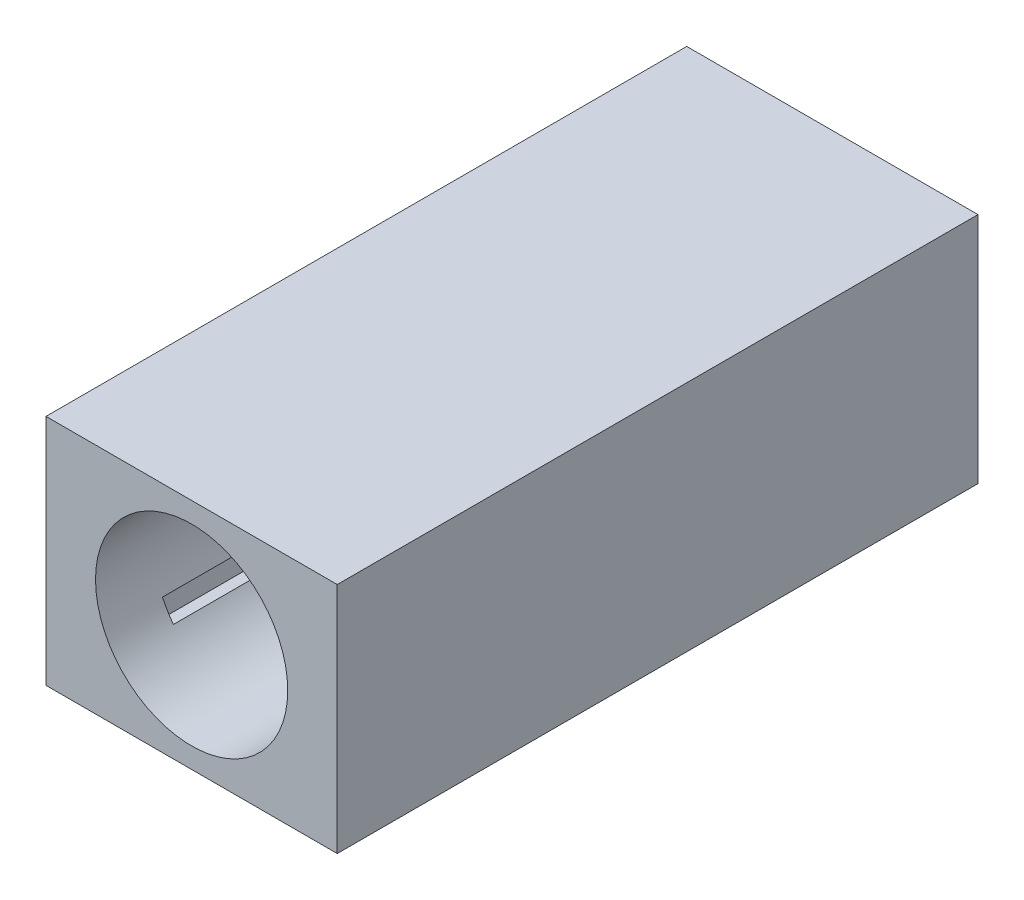
ISO-10303-21;
HEADER;
FILE_DESCRIPTION(('STEP AP214'),'2;1');
FILE_NAME('part.step','',(''),(''),'','','');
FILE_SCHEMA(('AUTOMOTIVE_DESIGN { 1 0 10303 214 1 1 1 1 }'));
ENDSEC;
DATA;
#1=APPLICATION_CONTEXT('core data for automotive mechanical design processes');
#2=APPLICATION_PROTOCOL_DEFINITION('international standard','automotive_design',2000,#1);
#3=PRODUCT_CONTEXT('',#1,'mechanical');
#4=PRODUCT('Part','Part','',(#3));
#5=PRODUCT_RELATED_PRODUCT_CATEGORY('part','',(#4));
#6=PRODUCT_DEFINITION_FORMATION('','',#4);
#7=PRODUCT_DEFINITION_CONTEXT('part definition',#1,'design');
#8=PRODUCT_DEFINITION('design','',#6,#7);
#9=PRODUCT_DEFINITION_SHAPE('','',#8);
#10=(LENGTH_UNIT() NAMED_UNIT(*) SI_UNIT(.MILLI.,.METRE.));
#11=(NAMED_UNIT(*) PLANE_ANGLE_UNIT() SI_UNIT($,.RADIAN.));
#12=(NAMED_UNIT(*) SI_UNIT($,.STERADIAN.) SOLID_ANGLE_UNIT());
#13=UNCERTAINTY_MEASURE_WITH_UNIT(LENGTH_MEASURE(1.E-05),#10,'distance_accuracy_value','');
#14=(GEOMETRIC_REPRESENTATION_CONTEXT(3) GLOBAL_UNCERTAINTY_ASSIGNED_CONTEXT((#13)) GLOBAL_UNIT_ASSIGNED_CONTEXT((#10,
#11,#12)) REPRESENTATION_CONTEXT('',''));
#15=CARTESIAN_POINT('',(0.,0.,0.));
#16=DIRECTION('',(0.,0.,1.));
#17=DIRECTION('',(1.,0.,0.));
#18=AXIS2_PLACEMENT_3D('',#15,#16,#17);
#19=CARTESIAN_POINT('',(1.5,-1.,10.));
#20=DIRECTION('',(-1.,0.,0.));
#21=DIRECTION('',(0.,0.,1.));
#22=AXIS2_PLACEMENT_3D('',#19,#20,#21);
#23=PLANE('',#22);
#24=DIRECTION('',(0.,0.,1.));
#25=VECTOR('',#24,1.);
#26=CARTESIAN_POINT('',(1.5,-0.687386354243377,0.));
#27=LINE('',#26,#25);
#28=CARTESIAN_POINT('',(1.5,-0.687386354243377,0.));
#29=VERTEX_POINT('',#28);
#30=CARTESIAN_POINT('',(1.5,-0.687386354243377,10.));
#31=VERTEX_POINT('',#30);
#32=EDGE_CURVE('E288',#29,#31,#27,.T.);
#33=ORIENTED_EDGE('',*,*,#32,.F.);
#34=DIRECTION('',(0.,1.,0.));
#35=VECTOR('',#34,1.);
#36=CARTESIAN_POINT('',(1.5,-1.,0.));
#37=LINE('',#36,#35);
#38=CARTESIAN_POINT('',(1.5,-1.,0.));
#39=VERTEX_POINT('',#38);
#40=EDGE_CURVE('E161',#39,#29,#37,.T.);
#41=ORIENTED_EDGE('',*,*,#40,.F.);
#42=DIRECTION('',(0.,0.,-1.));
#43=VECTOR('',#42,1.);
#44=CARTESIAN_POINT('',(1.5,-1.,10.));
#45=LINE('',#44,#43);
#46=CARTESIAN_POINT('',(1.5,-1.,10.));
#47=VERTEX_POINT('',#46);
#48=EDGE_CURVE('E189',#47,#39,#45,.T.);
#49=ORIENTED_EDGE('',*,*,#48,.F.);
#50=DIRECTION('',(0.,1.,0.));
#51=VECTOR('',#50,1.);
#52=CARTESIAN_POINT('',(1.5,-1.,10.));
#53=LINE('',#52,#51);
#54=EDGE_CURVE('E245',#47,#31,#53,.T.);
#55=ORIENTED_EDGE('',*,*,#54,.T.);
#56=EDGE_LOOP('',(#33,#41,#49,#55));
#57=FACE_BOUND('',#56,.T.);
#58=ADVANCED_FACE('F33',(#57),#23,.T.);
#59=CARTESIAN_POINT('',(1.5,0.999999999999999,10.));
#60=DIRECTION('',(0.,-1.,0.));
#61=DIRECTION('',(1.,0.,0.));
#62=AXIS2_PLACEMENT_3D('',#59,#60,#61);
#63=PLANE('',#62);
#64=DIRECTION('',(0.,0.,1.));
#65=VECTOR('',#64,1.);
#66=CARTESIAN_POINT('',(1.31244047484067,0.999999999999999,0.));
#67=LINE('',#66,#65);
#68=CARTESIAN_POINT('',(1.31244047484067,0.999999999999999,0.));
#69=VERTEX_POINT('',#68);
#70=CARTESIAN_POINT('',(1.31244047484067,0.999999999999999,10.));
#71=VERTEX_POINT('',#70);
#72=EDGE_CURVE('E155',#69,#71,#67,.T.);
#73=ORIENTED_EDGE('',*,*,#72,.F.);
#74=DIRECTION('',(-1.,0.,0.));
#75=VECTOR('',#74,1.);
#76=CARTESIAN_POINT('',(1.5,0.999999999999999,0.));
#77=LINE('',#76,#75);
#78=CARTESIAN_POINT('',(1.5,0.999999999999999,0.));
#79=VERTEX_POINT('',#78);
#80=EDGE_CURVE('E179',#79,#69,#77,.T.);
#81=ORIENTED_EDGE('',*,*,#80,.F.);
#82=DIRECTION('',(0.,0.,-1.));
#83=VECTOR('',#82,1.);
#84=CARTESIAN_POINT('',(1.5,0.999999999999999,10.));
#85=LINE('',#84,#83);
#86=CARTESIAN_POINT('',(1.5,0.999999999999999,10.));
#87=VERTEX_POINT('',#86);
#88=EDGE_CURVE('E168',#87,#79,#85,.T.);
#89=ORIENTED_EDGE('',*,*,#88,.F.);
#90=DIRECTION('',(-1.,0.,0.));
#91=VECTOR('',#90,1.);
#92=CARTESIAN_POINT('',(1.5,0.999999999999999,10.));
#93=LINE('',#92,#91);
#94=EDGE_CURVE('E249',#87,#71,#93,.T.);
#95=ORIENTED_EDGE('',*,*,#94,.T.);
#96=EDGE_LOOP('',(#73,#81,#89,#95));
#97=FACE_BOUND('',#96,.T.);
#98=ADVANCED_FACE('F295',(#97),#63,.T.);
#99=CARTESIAN_POINT('',(-1.5,0.999999999999999,10.));
#100=DIRECTION('',(1.,0.,0.));
#101=DIRECTION('',(0.,1.,0.));
#102=AXIS2_PLACEMENT_3D('',#99,#100,#101);
#103=PLANE('',#102);
#104=DIRECTION('',(0.,0.,1.));
#105=VECTOR('',#104,1.);
#106=CARTESIAN_POINT('',(-1.5,0.687386354243376,0.));
#107=LINE('',#106,#105);
#108=CARTESIAN_POINT('',(-1.5,0.687386354243376,0.));
#109=VERTEX_POINT('',#108);
#110=CARTESIAN_POINT('',(-1.5,0.687386354243376,10.));
#111=VERTEX_POINT('',#110);
#112=EDGE_CURVE('E282',#109,#111,#107,.T.);
#113=ORIENTED_EDGE('',*,*,#112,.F.);
#114=DIRECTION('',(0.,-1.,0.));
#115=VECTOR('',#114,1.);
#116=CARTESIAN_POINT('',(-1.5,0.999999999999999,0.));
#117=LINE('',#116,#115);
#118=CARTESIAN_POINT('',(-1.5,0.999999999999999,0.));
#119=VERTEX_POINT('',#118);
#120=EDGE_CURVE('E182',#119,#109,#117,.T.);
#121=ORIENTED_EDGE('',*,*,#120,.F.);
#122=DIRECTION('',(0.,0.,-1.));
#123=VECTOR('',#122,1.);
#124=CARTESIAN_POINT('',(-1.5,0.999999999999999,10.));
#125=LINE('',#124,#123);
#126=CARTESIAN_POINT('',(-1.5,0.999999999999999,10.));
#127=VERTEX_POINT('',#126);
#128=EDGE_CURVE('E195',#127,#119,#125,.T.);
#129=ORIENTED_EDGE('',*,*,#128,.F.);
#130=DIRECTION('',(0.,-1.,0.));
#131=VECTOR('',#130,1.);
#132=CARTESIAN_POINT('',(-1.5,0.999999999999999,10.));
#133=LINE('',#132,#131);
#134=EDGE_CURVE('E252',#127,#111,#133,.T.);
#135=ORIENTED_EDGE('',*,*,#134,.T.);
#136=EDGE_LOOP('',(#113,#121,#129,#135));
#137=FACE_BOUND('',#136,.T.);
#138=ADVANCED_FACE('F301',(#137),#103,.T.);
#139=CARTESIAN_POINT('',(-1.5,-1.,10.));
#140=DIRECTION('',(0.,1.,0.));
#141=DIRECTION('',(0.,0.,1.));
#142=AXIS2_PLACEMENT_3D('',#139,#140,#141);
#143=PLANE('',#142);
#144=DIRECTION('',(0.,0.,1.));
#145=VECTOR('',#144,1.);
#146=CARTESIAN_POINT('',(-1.31244047484067,-1.,0.));
#147=LINE('',#146,#145);
#148=CARTESIAN_POINT('',(-1.31244047484067,-1.,0.));
#149=VERTEX_POINT('',#148);
#150=CARTESIAN_POINT('',(-1.31244047484067,-1.,10.));
#151=VERTEX_POINT('',#150);
#152=EDGE_CURVE('E274',#149,#151,#147,.T.);
#153=ORIENTED_EDGE('',*,*,#152,.F.);
#154=DIRECTION('',(1.,0.,0.));
#155=VECTOR('',#154,1.);
#156=CARTESIAN_POINT('',(-1.5,-1.,0.));
#157=LINE('',#156,#155);
#158=CARTESIAN_POINT('',(-1.5,-1.,0.));
#159=VERTEX_POINT('',#158);
#160=EDGE_CURVE('E185',#159,#149,#157,.T.);
#161=ORIENTED_EDGE('',*,*,#160,.F.);
#162=DIRECTION('',(0.,0.,-1.));
#163=VECTOR('',#162,1.);
#164=CARTESIAN_POINT('',(-1.5,-1.,10.));
#165=LINE('',#164,#163);
#166=CARTESIAN_POINT('',(-1.5,-1.,10.));
#167=VERTEX_POINT('',#166);
#168=EDGE_CURVE('E192',#167,#159,#165,.T.);
#169=ORIENTED_EDGE('',*,*,#168,.F.);
#170=DIRECTION('',(1.,0.,0.));
#171=VECTOR('',#170,1.);
#172=CARTESIAN_POINT('',(-1.5,-1.,10.));
#173=LINE('',#172,#171);
#174=EDGE_CURVE('E177',#167,#151,#173,.T.);
#175=ORIENTED_EDGE('',*,*,#174,.T.);
#176=EDGE_LOOP('',(#153,#161,#169,#175));
#177=FACE_BOUND('',#176,.T.);
#178=ADVANCED_FACE('F273',(#177),#143,.T.);
#179=CARTESIAN_POINT('',(0.,0.,0.));
#180=DIRECTION('',(0.,0.,1.));
#181=DIRECTION('',(1.,0.,0.));
#182=AXIS2_PLACEMENT_3D('',#179,#180,#181);
#183=PLANE('',#182);
#184=DIRECTION('',(-1.,0.,0.));
#185=VECTOR('',#184,1.);
#186=CARTESIAN_POINT('',(2.5,2.,0.));
#187=LINE('',#186,#185);
#188=CARTESIAN_POINT('',(2.5,2.,0.));
#189=VERTEX_POINT('',#188);
#190=CARTESIAN_POINT('',(-2.5,2.,0.));
#191=VERTEX_POINT('',#190);
#192=EDGE_CURVE('E199',#189,#191,#187,.T.);
#193=ORIENTED_EDGE('',*,*,#192,.F.);
#194=DIRECTION('',(0.,1.,0.));
#195=VECTOR('',#194,1.);
#196=CARTESIAN_POINT('',(2.5,-2.,0.));
#197=LINE('',#196,#195);
#198=CARTESIAN_POINT('',(2.5,-2.,0.));
#199=VERTEX_POINT('',#198);
#200=EDGE_CURVE('E206',#199,#189,#197,.T.);
#201=ORIENTED_EDGE('',*,*,#200,.F.);
#202=DIRECTION('',(1.,0.,0.));
#203=VECTOR('',#202,1.);
#204=CARTESIAN_POINT('',(-2.5,-2.,0.));
#205=LINE('',#204,#203);
#206=CARTESIAN_POINT('',(-2.5,-2.,0.));
#207=VERTEX_POINT('',#206);
#208=EDGE_CURVE('E204',#207,#199,#205,.T.);
#209=ORIENTED_EDGE('',*,*,#208,.F.);
#210=DIRECTION('',(0.,-1.,0.));
#211=VECTOR('',#210,1.);
#212=CARTESIAN_POINT('',(-2.5,2.,0.));
#213=LINE('',#212,#211);
#214=EDGE_CURVE('E202',#191,#207,#213,.T.);
#215=ORIENTED_EDGE('',*,*,#214,.F.);
#216=EDGE_LOOP('',(#193,#201,#209,#215));
#217=FACE_BOUND('',#216,.T.);
#218=ORIENTED_EDGE('',*,*,#80,.T.);
#219=CARTESIAN_POINT('',(0.,0.,0.));
#220=DIRECTION('',(0.,0.,1.));
#221=DIRECTION('',(1.,0.,0.));
#222=AXIS2_PLACEMENT_3D('',#219,#220,#221);
#223=CIRCLE('',#222,1.65);
#224=CARTESIAN_POINT('',(-1.31244047484067,0.999999999999999,0.));
#225=VERTEX_POINT('',#224);
#226=EDGE_CURVE('E164',#69,#225,#223,.T.);
#227=ORIENTED_EDGE('',*,*,#226,.T.);
#228=EDGE_CURVE('E171',#225,#119,#77,.T.);
#229=ORIENTED_EDGE('',*,*,#228,.T.);
#230=ORIENTED_EDGE('',*,*,#120,.T.);
#231=CARTESIAN_POINT('',(-1.5,-0.687386354243376,0.));
#232=VERTEX_POINT('',#231);
#233=EDGE_CURVE('E276',#109,#232,#223,.T.);
#234=ORIENTED_EDGE('',*,*,#233,.T.);
#235=EDGE_CURVE('E181',#232,#159,#117,.T.);
#236=ORIENTED_EDGE('',*,*,#235,.T.);
#237=ORIENTED_EDGE('',*,*,#160,.T.);
#238=CARTESIAN_POINT('',(1.31244047484067,-1.,0.));
#239=VERTEX_POINT('',#238);
#240=EDGE_CURVE('E162',#149,#239,#223,.T.);
#241=ORIENTED_EDGE('',*,*,#240,.T.);
#242=EDGE_CURVE('E56',#239,#39,#157,.T.);
#243=ORIENTED_EDGE('',*,*,#242,.T.);
#244=ORIENTED_EDGE('',*,*,#40,.T.);
#245=CARTESIAN_POINT('',(1.5,0.687386354243377,0.));
#246=VERTEX_POINT('',#245);
#247=EDGE_CURVE('E149',#29,#246,#223,.T.);
#248=ORIENTED_EDGE('',*,*,#247,.T.);
#249=EDGE_CURVE('E159',#246,#79,#37,.T.);
#250=ORIENTED_EDGE('',*,*,#249,.T.);
#251=EDGE_LOOP('',(#218,#227,#229,#230,#234,#236,#237,#241,#243,#244,#248,#250));
#252=FACE_BOUND('',#251,.T.);
#253=ADVANCED_FACE('F158',(#217,#252),#183,.F.);
#254=CARTESIAN_POINT('',(2.5,2.,10.));
#255=DIRECTION('',(0.,-1.,0.));
#256=DIRECTION('',(1.,0.,0.));
#257=AXIS2_PLACEMENT_3D('',#254,#255,#256);
#258=PLANE('',#257);
#259=ORIENTED_EDGE('',*,*,#192,.T.);
#260=DIRECTION('',(0.,0.,-1.));
#261=VECTOR('',#260,1.);
#262=CARTESIAN_POINT('',(-2.5,2.,10.));
#263=LINE('',#262,#261);
#264=CARTESIAN_POINT('',(-2.5,2.,11.));
#265=VERTEX_POINT('',#264);
#266=EDGE_CURVE('E11',#265,#191,#263,.T.);
#267=ORIENTED_EDGE('',*,*,#266,.F.);
#268=DIRECTION('',(-1.,0.,0.));
#269=VECTOR('',#268,1.);
#270=CARTESIAN_POINT('',(-2.5,2.,11.));
#271=LINE('',#270,#269);
#272=CARTESIAN_POINT('',(2.5,2.,11.));
#273=VERTEX_POINT('',#272);
#274=EDGE_CURVE('E169',#273,#265,#271,.T.);
#275=ORIENTED_EDGE('',*,*,#274,.F.);
#276=DIRECTION('',(0.,0.,-1.));
#277=VECTOR('',#276,1.);
#278=CARTESIAN_POINT('',(2.5,2.,10.));
#279=LINE('',#278,#277);
#280=EDGE_CURVE('E208',#273,#189,#279,.T.);
#281=ORIENTED_EDGE('',*,*,#280,.T.);
#282=EDGE_LOOP('',(#259,#267,#275,#281));
#283=FACE_BOUND('',#282,.T.);
#284=ADVANCED_FACE('F35',(#283),#258,.F.);
#285=CARTESIAN_POINT('',(-2.5,2.,10.));
#286=DIRECTION('',(1.,0.,0.));
#287=DIRECTION('',(0.,1.,0.));
#288=AXIS2_PLACEMENT_3D('',#285,#286,#287);
#289=PLANE('',#288);
#290=ORIENTED_EDGE('',*,*,#214,.T.);
#291=DIRECTION('',(0.,0.,-1.));
#292=VECTOR('',#291,1.);
#293=CARTESIAN_POINT('',(-2.5,-2.,10.));
#294=LINE('',#293,#292);
#295=CARTESIAN_POINT('',(-2.5,-2.,11.));
#296=VERTEX_POINT('',#295);
#297=EDGE_CURVE('E41',#296,#207,#294,.T.);
#298=ORIENTED_EDGE('',*,*,#297,.F.);
#299=DIRECTION('',(0.,-1.,0.));
#300=VECTOR('',#299,1.);
#301=CARTESIAN_POINT('',(-2.5,2.,11.));
#302=LINE('',#301,#300);
#303=EDGE_CURVE('E235',#265,#296,#302,.T.);
#304=ORIENTED_EDGE('',*,*,#303,.F.);
#305=ORIENTED_EDGE('',*,*,#266,.T.);
#306=EDGE_LOOP('',(#290,#298,#304,#305));
#307=FACE_BOUND('',#306,.T.);
#308=ADVANCED_FACE('F236',(#307),#289,.F.);
#309=CARTESIAN_POINT('',(-2.5,-2.,10.));
#310=DIRECTION('',(0.,1.,0.));
#311=DIRECTION('',(0.,0.,1.));
#312=AXIS2_PLACEMENT_3D('',#309,#310,#311);
#313=PLANE('',#312);
#314=ORIENTED_EDGE('',*,*,#208,.T.);
#315=DIRECTION('',(0.,0.,-1.));
#316=VECTOR('',#315,1.);
#317=CARTESIAN_POINT('',(2.5,-2.,10.));
#318=LINE('',#317,#316);
#319=CARTESIAN_POINT('',(2.5,-2.,11.));
#320=VERTEX_POINT('',#319);
#321=EDGE_CURVE('E211',#320,#199,#318,.T.);
#322=ORIENTED_EDGE('',*,*,#321,.F.);
#323=DIRECTION('',(1.,0.,0.));
#324=VECTOR('',#323,1.);
#325=CARTESIAN_POINT('',(-2.5,-2.,11.));
#326=LINE('',#325,#324);
#327=EDGE_CURVE('E219',#296,#320,#326,.T.);
#328=ORIENTED_EDGE('',*,*,#327,.F.);
#329=ORIENTED_EDGE('',*,*,#297,.T.);
#330=EDGE_LOOP('',(#314,#322,#328,#329));
#331=FACE_BOUND('',#330,.T.);
#332=ADVANCED_FACE('F217',(#331),#313,.F.);
#333=CARTESIAN_POINT('',(2.5,-2.,10.));
#334=DIRECTION('',(-1.,0.,0.));
#335=DIRECTION('',(0.,0.,1.));
#336=AXIS2_PLACEMENT_3D('',#333,#334,#335);
#337=PLANE('',#336);
#338=ORIENTED_EDGE('',*,*,#200,.T.);
#339=ORIENTED_EDGE('',*,*,#280,.F.);
#340=DIRECTION('',(0.,1.,0.));
#341=VECTOR('',#340,1.);
#342=CARTESIAN_POINT('',(2.5,2.,11.));
#343=LINE('',#342,#341);
#344=EDGE_CURVE('E173',#320,#273,#343,.T.);
#345=ORIENTED_EDGE('',*,*,#344,.F.);
#346=ORIENTED_EDGE('',*,*,#321,.T.);
#347=EDGE_LOOP('',(#338,#339,#345,#346));
#348=FACE_BOUND('',#347,.T.);
#349=ADVANCED_FACE('F227',(#348),#337,.F.);
#350=DIRECTION('',(0.,0.,1.));
#351=VECTOR('',#350,1.);
#352=CARTESIAN_POINT('',(1.5,0.687386354243377,0.));
#353=LINE('',#352,#351);
#354=CARTESIAN_POINT('',(1.5,0.687386354243377,10.));
#355=VERTEX_POINT('',#354);
#356=EDGE_CURVE('E48',#355,#246,#353,.F.);
#357=ORIENTED_EDGE('',*,*,#356,.F.);
#358=EDGE_CURVE('E188',#355,#87,#53,.T.);
#359=ORIENTED_EDGE('',*,*,#358,.T.);
#360=ORIENTED_EDGE('',*,*,#88,.T.);
#361=ORIENTED_EDGE('',*,*,#249,.F.);
#362=EDGE_LOOP('',(#357,#359,#360,#361));
#363=FACE_BOUND('',#362,.T.);
#364=ADVANCED_FACE('F166',(#363),#23,.T.);
#365=DIRECTION('',(0.,0.,1.));
#366=VECTOR('',#365,1.);
#367=CARTESIAN_POINT('',(-1.31244047484067,0.999999999999999,0.));
#368=LINE('',#367,#366);
#369=CARTESIAN_POINT('',(-1.31244047484067,0.999999999999999,10.));
#370=VERTEX_POINT('',#369);
#371=EDGE_CURVE('E284',#370,#225,#368,.F.);
#372=ORIENTED_EDGE('',*,*,#371,.F.);
#373=EDGE_CURVE('E248',#370,#127,#93,.T.);
#374=ORIENTED_EDGE('',*,*,#373,.T.);
#375=ORIENTED_EDGE('',*,*,#128,.T.);
#376=ORIENTED_EDGE('',*,*,#228,.F.);
#377=EDGE_LOOP('',(#372,#374,#375,#376));
#378=FACE_BOUND('',#377,.T.);
#379=ADVANCED_FACE('F298',(#378),#63,.T.);
#380=DIRECTION('',(0.,0.,1.));
#381=VECTOR('',#380,1.);
#382=CARTESIAN_POINT('',(-1.5,-0.687386354243376,0.));
#383=LINE('',#382,#381);
#384=CARTESIAN_POINT('',(-1.5,-0.687386354243376,10.));
#385=VERTEX_POINT('',#384);
#386=EDGE_CURVE('E266',#385,#232,#383,.F.);
#387=ORIENTED_EDGE('',*,*,#386,.F.);
#388=EDGE_CURVE('E251',#385,#167,#133,.T.);
#389=ORIENTED_EDGE('',*,*,#388,.T.);
#390=ORIENTED_EDGE('',*,*,#168,.T.);
#391=ORIENTED_EDGE('',*,*,#235,.F.);
#392=EDGE_LOOP('',(#387,#389,#390,#391));
#393=FACE_BOUND('',#392,.T.);
#394=ADVANCED_FACE('F263',(#393),#103,.T.);
#395=DIRECTION('',(0.,0.,1.));
#396=VECTOR('',#395,1.);
#397=CARTESIAN_POINT('',(1.31244047484067,-1.,0.));
#398=LINE('',#397,#396);
#399=CARTESIAN_POINT('',(1.31244047484067,-1.,10.));
#400=VERTEX_POINT('',#399);
#401=EDGE_CURVE('E286',#400,#239,#398,.F.);
#402=ORIENTED_EDGE('',*,*,#401,.F.);
#403=EDGE_CURVE('E254',#400,#47,#173,.T.);
#404=ORIENTED_EDGE('',*,*,#403,.T.);
#405=ORIENTED_EDGE('',*,*,#48,.T.);
#406=ORIENTED_EDGE('',*,*,#242,.F.);
#407=EDGE_LOOP('',(#402,#404,#405,#406));
#408=FACE_BOUND('',#407,.T.);
#409=ADVANCED_FACE('F315',(#408),#143,.T.);
#410=CARTESIAN_POINT('',(0.,0.,10.));
#411=DIRECTION('',(0.,0.,1.));
#412=DIRECTION('',(1.,0.,0.));
#413=AXIS2_PLACEMENT_3D('',#410,#411,#412);
#414=PLANE('',#413);
#415=ORIENTED_EDGE('',*,*,#94,.F.);
#416=ORIENTED_EDGE('',*,*,#358,.F.);
#417=CARTESIAN_POINT('',(0.,0.,10.));
#418=DIRECTION('',(0.,0.,1.));
#419=DIRECTION('',(1.,0.,0.));
#420=AXIS2_PLACEMENT_3D('',#417,#418,#419);
#421=CIRCLE('',#420,1.65);
#422=EDGE_CURVE('E152',#355,#71,#421,.T.);
#423=ORIENTED_EDGE('',*,*,#422,.T.);
#424=EDGE_LOOP('',(#415,#416,#423));
#425=FACE_BOUND('',#424,.T.);
#426=ADVANCED_FACE('F293',(#425),#414,.F.);
#427=ORIENTED_EDGE('',*,*,#54,.F.);
#428=ORIENTED_EDGE('',*,*,#403,.F.);
#429=EDGE_CURVE('E154',#400,#31,#421,.T.);
#430=ORIENTED_EDGE('',*,*,#429,.T.);
#431=EDGE_LOOP('',(#427,#428,#430));
#432=FACE_BOUND('',#431,.T.);
#433=ADVANCED_FACE('F311',(#432),#414,.F.);
#434=ORIENTED_EDGE('',*,*,#373,.F.);
#435=EDGE_CURVE('E294',#370,#111,#421,.T.);
#436=ORIENTED_EDGE('',*,*,#435,.T.);
#437=ORIENTED_EDGE('',*,*,#134,.F.);
#438=EDGE_LOOP('',(#434,#436,#437));
#439=FACE_BOUND('',#438,.T.);
#440=ADVANCED_FACE('F305',(#439),#414,.F.);
#441=CARTESIAN_POINT('',(0.,0.,11.));
#442=DIRECTION('',(0.,0.,1.));
#443=DIRECTION('',(1.,0.,0.));
#444=AXIS2_PLACEMENT_3D('',#441,#442,#443);
#445=PLANE('',#444);
#446=ORIENTED_EDGE('',*,*,#303,.T.);
#447=ORIENTED_EDGE('',*,*,#327,.T.);
#448=ORIENTED_EDGE('',*,*,#344,.T.);
#449=ORIENTED_EDGE('',*,*,#274,.T.);
#450=EDGE_LOOP('',(#446,#447,#448,#449));
#451=FACE_BOUND('',#450,.T.);
#452=CARTESIAN_POINT('',(0.,0.,11.));
#453=DIRECTION('',(0.,0.,1.));
#454=DIRECTION('',(1.,0.,0.));
#455=AXIS2_PLACEMENT_3D('',#452,#453,#454);
#456=CIRCLE('',#455,1.65);
#457=CARTESIAN_POINT('',(1.65,0.,11.));
#458=VERTEX_POINT('',#457);
#459=EDGE_CURVE('E237',#458,#458,#456,.T.);
#460=ORIENTED_EDGE('',*,*,#459,.F.);
#461=EDGE_LOOP('',(#460));
#462=FACE_BOUND('',#461,.T.);
#463=ADVANCED_FACE('F233',(#451,#462),#445,.T.);
#464=ORIENTED_EDGE('',*,*,#174,.F.);
#465=ORIENTED_EDGE('',*,*,#388,.F.);
#466=EDGE_CURVE('E306',#385,#151,#421,.T.);
#467=ORIENTED_EDGE('',*,*,#466,.T.);
#468=EDGE_LOOP('',(#464,#465,#467));
#469=FACE_BOUND('',#468,.T.);
#470=ADVANCED_FACE('F323',(#469),#414,.F.);
#471=CARTESIAN_POINT('',(0.,0.,11.));
#472=DIRECTION('',(0.,0.,-1.));
#473=DIRECTION('',(-1.,0.,0.));
#474=AXIS2_PLACEMENT_3D('',#471,#472,#473);
#475=CYLINDRICAL_SURFACE('',#474,1.65);
#476=ORIENTED_EDGE('',*,*,#459,.T.);
#477=EDGE_LOOP('',(#476));
#478=FACE_BOUND('',#477,.T.);
#479=ORIENTED_EDGE('',*,*,#422,.F.);
#480=ORIENTED_EDGE('',*,*,#356,.T.);
#481=ORIENTED_EDGE('',*,*,#247,.F.);
#482=ORIENTED_EDGE('',*,*,#32,.T.);
#483=ORIENTED_EDGE('',*,*,#429,.F.);
#484=ORIENTED_EDGE('',*,*,#401,.T.);
#485=ORIENTED_EDGE('',*,*,#240,.F.);
#486=ORIENTED_EDGE('',*,*,#152,.T.);
#487=ORIENTED_EDGE('',*,*,#466,.F.);
#488=ORIENTED_EDGE('',*,*,#386,.T.);
#489=ORIENTED_EDGE('',*,*,#233,.F.);
#490=ORIENTED_EDGE('',*,*,#112,.T.);
#491=ORIENTED_EDGE('',*,*,#435,.F.);
#492=ORIENTED_EDGE('',*,*,#371,.T.);
#493=ORIENTED_EDGE('',*,*,#226,.F.);
#494=ORIENTED_EDGE('',*,*,#72,.T.);
#495=EDGE_LOOP('',(#479,#480,#481,#482,#483,#484,#485,#486,#487,#488,#489,#490,#491,#492,#493,#494));
#496=FACE_BOUND('',#495,.T.);
#497=ADVANCED_FACE('F148',(#478,#496),#475,.F.);
#498=CLOSED_SHELL('',(#58,#98,#138,#178,#253,#284,#308,#332,#349,#364,#379,#394,#409,#426,#433,
#440,#463,#470,#497));
#499=MANIFOLD_SOLID_BREP('B2',#498);
#500=ADVANCED_BREP_SHAPE_REPRESENTATION('',(#18,#499),#14);
#501=SHAPE_DEFINITION_REPRESENTATION(#9,#500);
ENDSEC;
END-ISO-10303-21;
